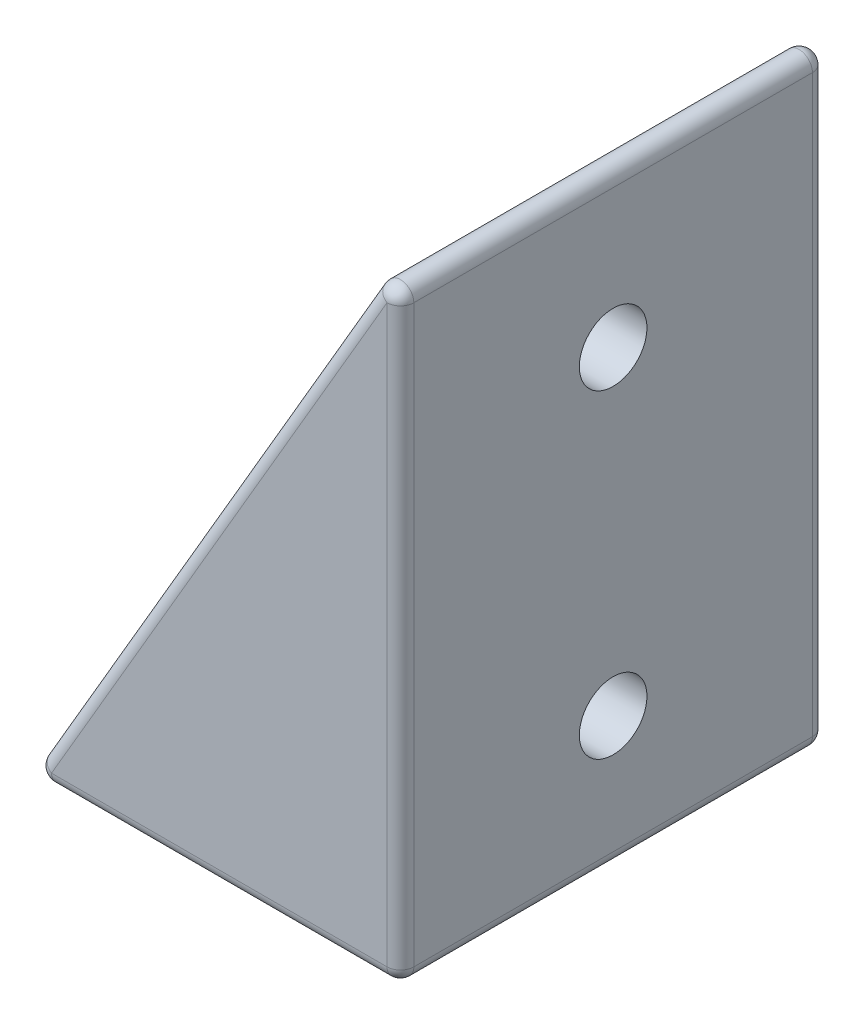
ISO-10303-21;
HEADER;
FILE_DESCRIPTION(('STEP AP214'),'2;1');
FILE_NAME('part.step','',(''),(''),'','','');
FILE_SCHEMA(('AUTOMOTIVE_DESIGN { 1 0 10303 214 1 1 1 1 }'));
ENDSEC;
DATA;
#1=APPLICATION_CONTEXT('core data for automotive mechanical design processes');
#2=APPLICATION_PROTOCOL_DEFINITION('international standard','automotive_design',2000,#1);
#3=PRODUCT_CONTEXT('',#1,'mechanical');
#4=PRODUCT('Part','Part','',(#3));
#5=PRODUCT_RELATED_PRODUCT_CATEGORY('part','',(#4));
#6=PRODUCT_DEFINITION_FORMATION('','',#4);
#7=PRODUCT_DEFINITION_CONTEXT('part definition',#1,'design');
#8=PRODUCT_DEFINITION('design','',#6,#7);
#9=PRODUCT_DEFINITION_SHAPE('','',#8);
#10=(LENGTH_UNIT() NAMED_UNIT(*) SI_UNIT(.MILLI.,.METRE.));
#11=(NAMED_UNIT(*) PLANE_ANGLE_UNIT() SI_UNIT($,.RADIAN.));
#12=(NAMED_UNIT(*) SI_UNIT($,.STERADIAN.) SOLID_ANGLE_UNIT());
#13=UNCERTAINTY_MEASURE_WITH_UNIT(LENGTH_MEASURE(1.E-05),#10,'distance_accuracy_value','');
#14=(GEOMETRIC_REPRESENTATION_CONTEXT(3) GLOBAL_UNCERTAINTY_ASSIGNED_CONTEXT((#13)) GLOBAL_UNIT_ASSIGNED_CONTEXT((#10,
#11,#12)) REPRESENTATION_CONTEXT('',''));
#15=CARTESIAN_POINT('',(0.,0.,0.));
#16=DIRECTION('',(0.,0.,1.));
#17=DIRECTION('',(1.,0.,0.));
#18=AXIS2_PLACEMENT_3D('',#15,#16,#17);
#19=CARTESIAN_POINT('',(-22.225,0.,25.4));
#20=DIRECTION('',(0.,1.,0.));
#21=DIRECTION('',(0.,0.,1.));
#22=AXIS2_PLACEMENT_3D('',#19,#20,#21);
#23=PLANE('',#22);
#24=DIRECTION('',(1.,0.,0.));
#25=VECTOR('',#24,1.);
#26=CARTESIAN_POINT('',(-22.225,0.,24.6));
#27=LINE('',#26,#25);
#28=CARTESIAN_POINT('',(-0.8,0.,24.6));
#29=VERTEX_POINT('',#28);
#30=CARTESIAN_POINT('',(-20.8321704007033,0.,24.6));
#31=VERTEX_POINT('',#30);
#32=EDGE_CURVE('E137',#29,#31,#27,.F.);
#33=ORIENTED_EDGE('',*,*,#32,.T.);
#34=DIRECTION('',(0.,0.,-1.));
#35=VECTOR('',#34,1.);
#36=CARTESIAN_POINT('',(-20.8321704007033,0.,25.4));
#37=LINE('',#36,#35);
#38=CARTESIAN_POINT('',(-20.8321704007033,0.,0.799999999999999));
#39=VERTEX_POINT('',#38);
#40=EDGE_CURVE('E141',#31,#39,#37,.T.);
#41=ORIENTED_EDGE('',*,*,#40,.T.);
#42=DIRECTION('',(1.,0.,0.));
#43=VECTOR('',#42,1.);
#44=CARTESIAN_POINT('',(-22.225,0.,0.799999999999999));
#45=LINE('',#44,#43);
#46=CARTESIAN_POINT('',(-0.8,0.,0.799999999999999));
#47=VERTEX_POINT('',#46);
#48=EDGE_CURVE('E113',#39,#47,#45,.T.);
#49=ORIENTED_EDGE('',*,*,#48,.T.);
#50=DIRECTION('',(0.,0.,-1.));
#51=VECTOR('',#50,1.);
#52=CARTESIAN_POINT('',(-0.799999999999999,0.,25.4));
#53=LINE('',#52,#51);
#54=EDGE_CURVE('E131',#47,#29,#53,.F.);
#55=ORIENTED_EDGE('',*,*,#54,.T.);
#56=EDGE_LOOP('',(#33,#41,#49,#55));
#57=FACE_BOUND('',#56,.T.);
#58=ADVANCED_FACE('F37',(#57),#23,.F.);
#59=CARTESIAN_POINT('',(0.,0.,25.4));
#60=DIRECTION('',(-1.,0.,0.));
#61=DIRECTION('',(0.,0.,1.));
#62=AXIS2_PLACEMENT_3D('',#59,#60,#61);
#63=PLANE('',#62);
#64=CARTESIAN_POINT('',(0.,26.8858635440629,12.7));
#65=DIRECTION('',(1.,0.,0.));
#66=DIRECTION('',(0.,0.,-1.));
#67=AXIS2_PLACEMENT_3D('',#64,#65,#66);
#68=CIRCLE('',#67,2.0193);
#69=CARTESIAN_POINT('',(0.,26.8858635440629,10.6807));
#70=VERTEX_POINT('',#69);
#71=EDGE_CURVE('E209',#70,#70,#68,.T.);
#72=ORIENTED_EDGE('',*,*,#71,.F.);
#73=EDGE_LOOP('',(#72));
#74=FACE_BOUND('',#73,.T.);
#75=CARTESIAN_POINT('',(0.,7.83586354406289,12.7));
#76=DIRECTION('',(1.,0.,0.));
#77=DIRECTION('',(0.,0.,-1.));
#78=AXIS2_PLACEMENT_3D('',#75,#76,#77);
#79=CIRCLE('',#78,2.0193);
#80=CARTESIAN_POINT('',(0.,7.83586354406289,10.6807));
#81=VERTEX_POINT('',#80);
#82=EDGE_CURVE('E214',#81,#81,#79,.T.);
#83=ORIENTED_EDGE('',*,*,#82,.F.);
#84=EDGE_LOOP('',(#83));
#85=FACE_BOUND('',#84,.T.);
#86=DIRECTION('',(0.,0.,-1.));
#87=VECTOR('',#86,1.);
#88=CARTESIAN_POINT('',(0.,0.8,25.4));
#89=LINE('',#88,#87);
#90=CARTESIAN_POINT('',(0.,0.8,24.6));
#91=VERTEX_POINT('',#90);
#92=CARTESIAN_POINT('',(0.,0.8,0.799999999999999));
#93=VERTEX_POINT('',#92);
#94=EDGE_CURVE('E154',#91,#93,#89,.T.);
#95=ORIENTED_EDGE('',*,*,#94,.T.);
#96=DIRECTION('',(0.,1.,0.));
#97=VECTOR('',#96,1.);
#98=CARTESIAN_POINT('',(0.,0.,0.799999999999999));
#99=LINE('',#98,#97);
#100=CARTESIAN_POINT('',(0.,35.1408635440629,0.799999999999999));
#101=VERTEX_POINT('',#100);
#102=EDGE_CURVE('E158',#93,#101,#99,.T.);
#103=ORIENTED_EDGE('',*,*,#102,.T.);
#104=DIRECTION('',(0.,0.,-1.));
#105=VECTOR('',#104,1.);
#106=CARTESIAN_POINT('',(0.,35.1408635440629,25.4));
#107=LINE('',#106,#105);
#108=CARTESIAN_POINT('',(0.,35.1408635440629,24.6));
#109=VERTEX_POINT('',#108);
#110=EDGE_CURVE('E156',#101,#109,#107,.F.);
#111=ORIENTED_EDGE('',*,*,#110,.T.);
#112=DIRECTION('',(0.,1.,0.));
#113=VECTOR('',#112,1.);
#114=CARTESIAN_POINT('',(0.,0.,24.6));
#115=LINE('',#114,#113);
#116=EDGE_CURVE('E152',#109,#91,#115,.F.);
#117=ORIENTED_EDGE('',*,*,#116,.T.);
#118=EDGE_LOOP('',(#95,#103,#111,#117));
#119=FACE_BOUND('',#118,.T.);
#120=ADVANCED_FACE('F225',(#74,#85,#119),#63,.F.);
#121=CARTESIAN_POINT('',(0.,38.1,25.4));
#122=DIRECTION('',(0.863778900898433,-0.503871025524086,0.));
#123=DIRECTION('',(0.503871025524086,0.863778900898434,0.));
#124=AXIS2_PLACEMENT_3D('',#121,#122,#123);
#125=PLANE('',#124);
#126=CARTESIAN_POINT('',(-6.54157959929665,26.8858635440629,12.7));
#127=DIRECTION('',(0.863778900898433,-0.503871025524086,0.));
#128=DIRECTION('',(0.503871025524086,0.863778900898434,0.));
#129=AXIS2_PLACEMENT_3D('',#126,#127,#128);
#130=ELLIPSE('',#129,2.33775101232467,2.0193);
#131=CARTESIAN_POINT('',(-5.36365459929665,28.9051635440629,12.7));
#132=VERTEX_POINT('',#131);
#133=EDGE_CURVE('E41',#132,#132,#130,.T.);
#134=ORIENTED_EDGE('',*,*,#133,.T.);
#135=EDGE_LOOP('',(#134));
#136=FACE_BOUND('',#135,.T.);
#137=CARTESIAN_POINT('',(-17.6540795992967,7.83586354406289,12.7));
#138=DIRECTION('',(0.863778900898433,-0.503871025524086,0.));
#139=DIRECTION('',(0.503871025524086,0.863778900898434,0.));
#140=AXIS2_PLACEMENT_3D('',#137,#138,#139);
#141=ELLIPSE('',#140,2.33775101232467,2.0193);
#142=CARTESIAN_POINT('',(-16.4761545992966,9.85516354406289,12.7));
#143=VERTEX_POINT('',#142);
#144=EDGE_CURVE('E207',#143,#143,#141,.T.);
#145=ORIENTED_EDGE('',*,*,#144,.T.);
#146=EDGE_LOOP('',(#145));
#147=FACE_BOUND('',#146,.T.);
#148=DIRECTION('',(-0.503871025524086,-0.863778900898434,0.));
#149=VECTOR('',#148,1.);
#150=CARTESIAN_POINT('',(0.,38.1,0.799999999999999));
#151=LINE('',#150,#149);
#152=CARTESIAN_POINT('',(-1.49102312071874,35.5439603644822,0.799999999999999));
#153=VERTEX_POINT('',#152);
#154=CARTESIAN_POINT('',(-21.5231935214221,1.20309682041927,0.799999999999999));
#155=VERTEX_POINT('',#154);
#156=EDGE_CURVE('E165',#153,#155,#151,.T.);
#157=ORIENTED_EDGE('',*,*,#156,.T.);
#158=DIRECTION('',(0.,0.,-1.));
#159=VECTOR('',#158,1.);
#160=CARTESIAN_POINT('',(-21.5231935214221,1.20309682041927,25.4));
#161=LINE('',#160,#159);
#162=CARTESIAN_POINT('',(-21.5231935214221,1.20309682041927,24.6));
#163=VERTEX_POINT('',#162);
#164=EDGE_CURVE('E168',#155,#163,#161,.F.);
#165=ORIENTED_EDGE('',*,*,#164,.T.);
#166=DIRECTION('',(-0.503871025524086,-0.863778900898434,0.));
#167=VECTOR('',#166,1.);
#168=CARTESIAN_POINT('',(0.,38.1,24.6));
#169=LINE('',#168,#167);
#170=CARTESIAN_POINT('',(-1.49102312071874,35.5439603644822,24.6));
#171=VERTEX_POINT('',#170);
#172=EDGE_CURVE('E163',#163,#171,#169,.F.);
#173=ORIENTED_EDGE('',*,*,#172,.T.);
#174=DIRECTION('',(0.,0.,-1.));
#175=VECTOR('',#174,1.);
#176=CARTESIAN_POINT('',(-1.49102312071874,35.5439603644822,25.4));
#177=LINE('',#176,#175);
#178=EDGE_CURVE('E161',#171,#153,#177,.T.);
#179=ORIENTED_EDGE('',*,*,#178,.T.);
#180=EDGE_LOOP('',(#157,#165,#173,#179));
#181=FACE_BOUND('',#180,.T.);
#182=ADVANCED_FACE('F228',(#136,#147,#181),#125,.F.);
#183=CARTESIAN_POINT('',(0.,0.,25.4));
#184=DIRECTION('',(0.,0.,1.));
#185=DIRECTION('',(1.,0.,0.));
#186=AXIS2_PLACEMENT_3D('',#183,#184,#185);
#187=PLANE('',#186);
#188=DIRECTION('',(-0.503871025524086,-0.863778900898434,0.));
#189=VECTOR('',#188,1.);
#190=CARTESIAN_POINT('',(-21.5339768792813,-0.403096820419269,25.4));
#191=LINE('',#190,#189);
#192=CARTESIAN_POINT('',(-0.8,35.1408635440629,25.4));
#193=VERTEX_POINT('',#192);
#194=CARTESIAN_POINT('',(-20.8321704007033,0.799999999999999,25.4));
#195=VERTEX_POINT('',#194);
#196=EDGE_CURVE('E46',#193,#195,#191,.T.);
#197=ORIENTED_EDGE('',*,*,#196,.T.);
#198=DIRECTION('',(1.,0.,0.));
#199=VECTOR('',#198,1.);
#200=CARTESIAN_POINT('',(0.,0.8,25.4));
#201=LINE('',#200,#199);
#202=CARTESIAN_POINT('',(-0.8,0.8,25.4));
#203=VERTEX_POINT('',#202);
#204=EDGE_CURVE('E11',#195,#203,#201,.T.);
#205=ORIENTED_EDGE('',*,*,#204,.T.);
#206=DIRECTION('',(0.,1.,0.));
#207=VECTOR('',#206,1.);
#208=CARTESIAN_POINT('',(-0.8,38.1,25.4));
#209=LINE('',#208,#207);
#210=EDGE_CURVE('E56',#203,#193,#209,.T.);
#211=ORIENTED_EDGE('',*,*,#210,.T.);
#212=EDGE_LOOP('',(#197,#205,#211));
#213=FACE_BOUND('',#212,.T.);
#214=ADVANCED_FACE('F276',(#213),#187,.T.);
#215=CARTESIAN_POINT('',(0.,0.,0.));
#216=DIRECTION('',(0.,0.,1.));
#217=DIRECTION('',(1.,0.,0.));
#218=AXIS2_PLACEMENT_3D('',#215,#216,#217);
#219=PLANE('',#218);
#220=DIRECTION('',(0.,1.,0.));
#221=VECTOR('',#220,1.);
#222=CARTESIAN_POINT('',(-0.8,0.,0.));
#223=LINE('',#222,#221);
#224=CARTESIAN_POINT('',(-0.8,35.1408635440629,0.));
#225=VERTEX_POINT('',#224);
#226=CARTESIAN_POINT('',(-0.8,0.8,0.));
#227=VERTEX_POINT('',#226);
#228=EDGE_CURVE('E149',#225,#227,#223,.F.);
#229=ORIENTED_EDGE('',*,*,#228,.T.);
#230=DIRECTION('',(1.,0.,0.));
#231=VECTOR('',#230,1.);
#232=CARTESIAN_POINT('',(0.,0.8,0.));
#233=LINE('',#232,#231);
#234=CARTESIAN_POINT('',(-20.8321704007033,0.8,0.));
#235=VERTEX_POINT('',#234);
#236=EDGE_CURVE('E115',#227,#235,#233,.F.);
#237=ORIENTED_EDGE('',*,*,#236,.T.);
#238=DIRECTION('',(-0.503871025524086,-0.863778900898434,0.));
#239=VECTOR('',#238,1.);
#240=CARTESIAN_POINT('',(-15.8913602989704,9.26996017439938,0.));
#241=LINE('',#240,#239);
#242=EDGE_CURVE('E144',#235,#225,#241,.F.);
#243=ORIENTED_EDGE('',*,*,#242,.T.);
#244=EDGE_LOOP('',(#229,#237,#243));
#245=FACE_BOUND('',#244,.T.);
#246=ADVANCED_FACE('F274',(#245),#219,.F.);
#247=CARTESIAN_POINT('',(-0.799999999999999,35.1408635440629,24.6));
#248=DIRECTION('',(0.,0.,1.));
#249=DIRECTION('',(1.,0.,0.));
#250=AXIS2_PLACEMENT_3D('',#247,#248,#249);
#251=SPHERICAL_SURFACE('',#250,0.8);
#252=CARTESIAN_POINT('',(-0.8,35.1408635440629,24.6));
#253=DIRECTION('',(0.,0.,1.));
#254=DIRECTION('',(1.,0.,0.));
#255=AXIS2_PLACEMENT_3D('',#252,#253,#254);
#256=CIRCLE('',#255,0.8);
#257=EDGE_CURVE('E201',#171,#109,#256,.F.);
#258=ORIENTED_EDGE('',*,*,#257,.F.);
#259=CARTESIAN_POINT('',(-0.799999999999998,35.1408635440629,24.6));
#260=DIRECTION('',(0.503871025524083,0.863778900898435,0.));
#261=DIRECTION('',(-0.863778900898435,0.503871025524083,0.));
#262=AXIS2_PLACEMENT_3D('',#259,#260,#261);
#263=CIRCLE('',#262,0.8);
#264=EDGE_CURVE('E138',#193,#171,#263,.F.);
#265=ORIENTED_EDGE('',*,*,#264,.F.);
#266=CARTESIAN_POINT('',(-0.8,35.1408635440629,24.6));
#267=DIRECTION('',(0.,1.,0.));
#268=DIRECTION('',(0.,0.,1.));
#269=AXIS2_PLACEMENT_3D('',#266,#267,#268);
#270=CIRCLE('',#269,0.8);
#271=EDGE_CURVE('E204',#109,#193,#270,.F.);
#272=ORIENTED_EDGE('',*,*,#271,.F.);
#273=EDGE_LOOP('',(#258,#265,#272));
#274=FACE_BOUND('',#273,.T.);
#275=ADVANCED_FACE('F39',(#274),#251,.T.);
#276=CARTESIAN_POINT('',(-15.8913602989704,9.26996017439938,24.6));
#277=DIRECTION('',(0.503871025524086,0.863778900898434,0.));
#278=DIRECTION('',(-0.863778900898434,0.503871025524086,0.));
#279=AXIS2_PLACEMENT_3D('',#276,#277,#278);
#280=CYLINDRICAL_SURFACE('',#279,0.8);
#281=ORIENTED_EDGE('',*,*,#264,.T.);
#282=ORIENTED_EDGE('',*,*,#172,.F.);
#283=CARTESIAN_POINT('',(-20.8321704007033,0.799999999999999,24.6));
#284=DIRECTION('',(-0.503871025524088,-0.863778900898432,0.));
#285=DIRECTION('',(0.863778900898432,-0.503871025524088,0.));
#286=AXIS2_PLACEMENT_3D('',#283,#284,#285);
#287=CIRCLE('',#286,0.8);
#288=EDGE_CURVE('E198',#195,#163,#287,.T.);
#289=ORIENTED_EDGE('',*,*,#288,.F.);
#290=ORIENTED_EDGE('',*,*,#196,.F.);
#291=EDGE_LOOP('',(#281,#282,#289,#290));
#292=FACE_BOUND('',#291,.T.);
#293=ADVANCED_FACE('F282',(#292),#280,.T.);
#294=CARTESIAN_POINT('',(0.,0.8,24.6));
#295=DIRECTION('',(-1.,0.,0.));
#296=DIRECTION('',(0.,0.,1.));
#297=AXIS2_PLACEMENT_3D('',#294,#295,#296);
#298=CYLINDRICAL_SURFACE('',#297,0.8);
#299=CARTESIAN_POINT('',(-0.8,0.8,24.6));
#300=DIRECTION('',(1.,0.,0.));
#301=DIRECTION('',(0.,0.,-1.));
#302=AXIS2_PLACEMENT_3D('',#299,#300,#301);
#303=CIRCLE('',#302,0.8);
#304=EDGE_CURVE('E192',#203,#29,#303,.T.);
#305=ORIENTED_EDGE('',*,*,#304,.F.);
#306=ORIENTED_EDGE('',*,*,#204,.F.);
#307=CARTESIAN_POINT('',(-20.8321704007033,0.8,24.6));
#308=DIRECTION('',(-1.,0.,0.));
#309=DIRECTION('',(0.,0.,1.));
#310=AXIS2_PLACEMENT_3D('',#307,#308,#309);
#311=CIRCLE('',#310,0.8);
#312=EDGE_CURVE('E195',#31,#195,#311,.T.);
#313=ORIENTED_EDGE('',*,*,#312,.F.);
#314=ORIENTED_EDGE('',*,*,#32,.F.);
#315=EDGE_LOOP('',(#305,#306,#313,#314));
#316=FACE_BOUND('',#315,.T.);
#317=ADVANCED_FACE('F257',(#316),#298,.T.);
#318=CARTESIAN_POINT('',(-0.8,0.,24.6));
#319=DIRECTION('',(0.,-1.,0.));
#320=DIRECTION('',(0.,0.,-1.));
#321=AXIS2_PLACEMENT_3D('',#318,#319,#320);
#322=CYLINDRICAL_SURFACE('',#321,0.8);
#323=ORIENTED_EDGE('',*,*,#271,.T.);
#324=ORIENTED_EDGE('',*,*,#210,.F.);
#325=CARTESIAN_POINT('',(-0.8,0.8,24.6));
#326=DIRECTION('',(0.,-1.,0.));
#327=DIRECTION('',(0.,0.,-1.));
#328=AXIS2_PLACEMENT_3D('',#325,#326,#327);
#329=CIRCLE('',#328,0.8);
#330=EDGE_CURVE('E190',#91,#203,#329,.T.);
#331=ORIENTED_EDGE('',*,*,#330,.F.);
#332=ORIENTED_EDGE('',*,*,#116,.F.);
#333=EDGE_LOOP('',(#323,#324,#331,#332));
#334=FACE_BOUND('',#333,.T.);
#335=ADVANCED_FACE('F252',(#334),#322,.T.);
#336=CARTESIAN_POINT('',(-0.8,35.1408635440629,25.4));
#337=DIRECTION('',(0.,0.,-1.));
#338=DIRECTION('',(-1.,0.,0.));
#339=AXIS2_PLACEMENT_3D('',#336,#337,#338);
#340=CYLINDRICAL_SURFACE('',#339,0.8);
#341=ORIENTED_EDGE('',*,*,#257,.T.);
#342=ORIENTED_EDGE('',*,*,#110,.F.);
#343=CARTESIAN_POINT('',(-0.799999999999998,35.1408635440629,0.799999999999999));
#344=DIRECTION('',(0.,0.,-1.));
#345=DIRECTION('',(-1.,0.,0.));
#346=AXIS2_PLACEMENT_3D('',#343,#344,#345);
#347=CIRCLE('',#346,0.8);
#348=EDGE_CURVE('E187',#153,#101,#347,.T.);
#349=ORIENTED_EDGE('',*,*,#348,.F.);
#350=ORIENTED_EDGE('',*,*,#178,.F.);
#351=EDGE_LOOP('',(#341,#342,#349,#350));
#352=FACE_BOUND('',#351,.T.);
#353=ADVANCED_FACE('F246',(#352),#340,.T.);
#354=CARTESIAN_POINT('',(-20.8321704007033,0.8,24.6));
#355=DIRECTION('',(0.,0.,1.));
#356=DIRECTION('',(1.,0.,0.));
#357=AXIS2_PLACEMENT_3D('',#354,#355,#356);
#358=SPHERICAL_SURFACE('',#357,0.8);
#359=ORIENTED_EDGE('',*,*,#312,.T.);
#360=ORIENTED_EDGE('',*,*,#288,.T.);
#361=CARTESIAN_POINT('',(-20.8321704007033,0.799999999999999,24.6));
#362=DIRECTION('',(0.,0.,1.));
#363=DIRECTION('',(1.,0.,0.));
#364=AXIS2_PLACEMENT_3D('',#361,#362,#363);
#365=CIRCLE('',#364,0.8);
#366=EDGE_CURVE('E181',#31,#163,#365,.F.);
#367=ORIENTED_EDGE('',*,*,#366,.F.);
#368=EDGE_LOOP('',(#359,#360,#367));
#369=FACE_BOUND('',#368,.T.);
#370=ADVANCED_FACE('F262',(#369),#358,.T.);
#371=CARTESIAN_POINT('',(-0.8,0.8,24.6));
#372=DIRECTION('',(0.,0.,1.));
#373=DIRECTION('',(1.,0.,0.));
#374=AXIS2_PLACEMENT_3D('',#371,#372,#373);
#375=SPHERICAL_SURFACE('',#374,0.8);
#376=ORIENTED_EDGE('',*,*,#330,.T.);
#377=ORIENTED_EDGE('',*,*,#304,.T.);
#378=CARTESIAN_POINT('',(-0.8,0.8,24.6));
#379=DIRECTION('',(0.,0.,1.));
#380=DIRECTION('',(1.,0.,0.));
#381=AXIS2_PLACEMENT_3D('',#378,#379,#380);
#382=CIRCLE('',#381,0.8);
#383=EDGE_CURVE('E134',#91,#29,#382,.F.);
#384=ORIENTED_EDGE('',*,*,#383,.F.);
#385=EDGE_LOOP('',(#376,#377,#384));
#386=FACE_BOUND('',#385,.T.);
#387=ADVANCED_FACE('F255',(#386),#375,.T.);
#388=CARTESIAN_POINT('',(-0.799999999999999,35.1408635440629,0.799999999999999));
#389=DIRECTION('',(0.,0.,-1.));
#390=DIRECTION('',(-1.,0.,0.));
#391=AXIS2_PLACEMENT_3D('',#388,#389,#390);
#392=SPHERICAL_SURFACE('',#391,0.8);
#393=CARTESIAN_POINT('',(-0.8,35.1408635440629,0.799999999999999));
#394=DIRECTION('',(0.,1.,0.));
#395=DIRECTION('',(0.,0.,1.));
#396=AXIS2_PLACEMENT_3D('',#393,#394,#395);
#397=CIRCLE('',#396,0.8);
#398=EDGE_CURVE('E178',#225,#101,#397,.F.);
#399=ORIENTED_EDGE('',*,*,#398,.F.);
#400=CARTESIAN_POINT('',(-0.8,35.1408635440629,0.8));
#401=DIRECTION('',(0.503871025524084,0.863778900898435,0.));
#402=DIRECTION('',(-0.863778900898435,0.503871025524084,0.));
#403=AXIS2_PLACEMENT_3D('',#400,#401,#402);
#404=CIRCLE('',#403,0.8);
#405=EDGE_CURVE('E184',#153,#225,#404,.F.);
#406=ORIENTED_EDGE('',*,*,#405,.F.);
#407=ORIENTED_EDGE('',*,*,#348,.T.);
#408=EDGE_LOOP('',(#399,#406,#407));
#409=FACE_BOUND('',#408,.T.);
#410=ADVANCED_FACE('F242',(#409),#392,.T.);
#411=CARTESIAN_POINT('',(0.691023120718747,37.6969031795807,0.799999999999999));
#412=DIRECTION('',(-0.503871025524086,-0.863778900898434,0.));
#413=DIRECTION('',(0.863778900898434,-0.503871025524086,0.));
#414=AXIS2_PLACEMENT_3D('',#411,#412,#413);
#415=CYLINDRICAL_SURFACE('',#414,0.8);
#416=ORIENTED_EDGE('',*,*,#405,.T.);
#417=ORIENTED_EDGE('',*,*,#242,.F.);
#418=CARTESIAN_POINT('',(-20.8321704007033,0.799999999999999,0.799999999999999));
#419=DIRECTION('',(-0.503871025524086,-0.863778900898433,0.));
#420=DIRECTION('',(0.863778900898433,-0.503871025524086,0.));
#421=AXIS2_PLACEMENT_3D('',#418,#419,#420);
#422=CIRCLE('',#421,0.8);
#423=EDGE_CURVE('E175',#155,#235,#422,.T.);
#424=ORIENTED_EDGE('',*,*,#423,.F.);
#425=ORIENTED_EDGE('',*,*,#156,.F.);
#426=EDGE_LOOP('',(#416,#417,#424,#425));
#427=FACE_BOUND('',#426,.T.);
#428=ADVANCED_FACE('F272',(#427),#415,.T.);
#429=CARTESIAN_POINT('',(-20.8321704007033,0.8,25.4));
#430=DIRECTION('',(0.,0.,-1.));
#431=DIRECTION('',(-1.,0.,0.));
#432=AXIS2_PLACEMENT_3D('',#429,#430,#431);
#433=CYLINDRICAL_SURFACE('',#432,0.8);
#434=ORIENTED_EDGE('',*,*,#366,.T.);
#435=ORIENTED_EDGE('',*,*,#164,.F.);
#436=CARTESIAN_POINT('',(-20.8321704007033,0.8,0.799999999999999));
#437=DIRECTION('',(0.,0.,-1.));
#438=DIRECTION('',(-1.,0.,0.));
#439=AXIS2_PLACEMENT_3D('',#436,#437,#438);
#440=CIRCLE('',#439,0.8);
#441=EDGE_CURVE('E128',#39,#155,#440,.T.);
#442=ORIENTED_EDGE('',*,*,#441,.F.);
#443=ORIENTED_EDGE('',*,*,#40,.F.);
#444=EDGE_LOOP('',(#434,#435,#442,#443));
#445=FACE_BOUND('',#444,.T.);
#446=ADVANCED_FACE('F265',(#445),#433,.T.);
#447=CARTESIAN_POINT('',(-0.8,0.8,25.4));
#448=DIRECTION('',(0.,0.,-1.));
#449=DIRECTION('',(-1.,0.,0.));
#450=AXIS2_PLACEMENT_3D('',#447,#448,#449);
#451=CYLINDRICAL_SURFACE('',#450,0.8);
#452=ORIENTED_EDGE('',*,*,#383,.T.);
#453=ORIENTED_EDGE('',*,*,#54,.F.);
#454=CARTESIAN_POINT('',(-0.8,0.8,0.799999999999999));
#455=DIRECTION('',(0.,0.,-1.));
#456=DIRECTION('',(-1.,0.,0.));
#457=AXIS2_PLACEMENT_3D('',#454,#455,#456);
#458=CIRCLE('',#457,0.8);
#459=EDGE_CURVE('E121',#93,#47,#458,.T.);
#460=ORIENTED_EDGE('',*,*,#459,.F.);
#461=ORIENTED_EDGE('',*,*,#94,.F.);
#462=EDGE_LOOP('',(#452,#453,#460,#461));
#463=FACE_BOUND('',#462,.T.);
#464=ADVANCED_FACE('F132',(#463),#451,.T.);
#465=CARTESIAN_POINT('',(-0.8,0.,0.799999999999999));
#466=DIRECTION('',(0.,1.,0.));
#467=DIRECTION('',(0.,0.,1.));
#468=AXIS2_PLACEMENT_3D('',#465,#466,#467);
#469=CYLINDRICAL_SURFACE('',#468,0.8);
#470=ORIENTED_EDGE('',*,*,#398,.T.);
#471=ORIENTED_EDGE('',*,*,#102,.F.);
#472=CARTESIAN_POINT('',(-0.8,0.8,0.8));
#473=DIRECTION('',(0.,-1.,0.));
#474=DIRECTION('',(0.,0.,-1.));
#475=AXIS2_PLACEMENT_3D('',#472,#473,#474);
#476=CIRCLE('',#475,0.8);
#477=EDGE_CURVE('E125',#227,#93,#476,.T.);
#478=ORIENTED_EDGE('',*,*,#477,.F.);
#479=ORIENTED_EDGE('',*,*,#228,.F.);
#480=EDGE_LOOP('',(#470,#471,#478,#479));
#481=FACE_BOUND('',#480,.T.);
#482=ADVANCED_FACE('F235',(#481),#469,.T.);
#483=CARTESIAN_POINT('',(-20.8321704007033,0.8,0.8));
#484=DIRECTION('',(0.,0.,-1.));
#485=DIRECTION('',(-1.,0.,0.));
#486=AXIS2_PLACEMENT_3D('',#483,#484,#485);
#487=SPHERICAL_SURFACE('',#486,0.8);
#488=ORIENTED_EDGE('',*,*,#441,.T.);
#489=ORIENTED_EDGE('',*,*,#423,.T.);
#490=CARTESIAN_POINT('',(-20.8321704007033,0.8,0.8));
#491=DIRECTION('',(-1.,0.,0.));
#492=DIRECTION('',(0.,0.,1.));
#493=AXIS2_PLACEMENT_3D('',#490,#491,#492);
#494=CIRCLE('',#493,0.8);
#495=EDGE_CURVE('E118',#39,#235,#494,.F.);
#496=ORIENTED_EDGE('',*,*,#495,.F.);
#497=EDGE_LOOP('',(#488,#489,#496));
#498=FACE_BOUND('',#497,.T.);
#499=ADVANCED_FACE('F269',(#498),#487,.T.);
#500=CARTESIAN_POINT('',(-0.8,0.8,0.8));
#501=DIRECTION('',(1.,0.,0.));
#502=DIRECTION('',(0.,0.,-1.));
#503=AXIS2_PLACEMENT_3D('',#500,#501,#502);
#504=SPHERICAL_SURFACE('',#503,0.8);
#505=ORIENTED_EDGE('',*,*,#477,.T.);
#506=ORIENTED_EDGE('',*,*,#459,.T.);
#507=CARTESIAN_POINT('',(-0.8,0.8,0.799999999999999));
#508=DIRECTION('',(1.,0.,0.));
#509=DIRECTION('',(0.,0.,-1.));
#510=AXIS2_PLACEMENT_3D('',#507,#508,#509);
#511=CIRCLE('',#510,0.8);
#512=EDGE_CURVE('E109',#227,#47,#511,.F.);
#513=ORIENTED_EDGE('',*,*,#512,.F.);
#514=EDGE_LOOP('',(#505,#506,#513));
#515=FACE_BOUND('',#514,.T.);
#516=ADVANCED_FACE('F123',(#515),#504,.T.);
#517=CARTESIAN_POINT('',(-22.225,0.8,0.799999999999999));
#518=DIRECTION('',(1.,0.,0.));
#519=DIRECTION('',(0.,0.,-1.));
#520=AXIS2_PLACEMENT_3D('',#517,#518,#519);
#521=CYLINDRICAL_SURFACE('',#520,0.8);
#522=ORIENTED_EDGE('',*,*,#495,.T.);
#523=ORIENTED_EDGE('',*,*,#236,.F.);
#524=ORIENTED_EDGE('',*,*,#512,.T.);
#525=ORIENTED_EDGE('',*,*,#48,.F.);
#526=EDGE_LOOP('',(#522,#523,#524,#525));
#527=FACE_BOUND('',#526,.T.);
#528=ADVANCED_FACE('F111',(#527),#521,.T.);
#529=CARTESIAN_POINT('',(-50.8,7.83586354406289,12.7));
#530=DIRECTION('',(1.,0.,0.));
#531=DIRECTION('',(0.,0.,-1.));
#532=AXIS2_PLACEMENT_3D('',#529,#530,#531);
#533=CYLINDRICAL_SURFACE('',#532,2.0193);
#534=ORIENTED_EDGE('',*,*,#82,.T.);
#535=EDGE_LOOP('',(#534));
#536=FACE_BOUND('',#535,.T.);
#537=ORIENTED_EDGE('',*,*,#144,.F.);
#538=EDGE_LOOP('',(#537));
#539=FACE_BOUND('',#538,.T.);
#540=ADVANCED_FACE('F222',(#536,#539),#533,.F.);
#541=CARTESIAN_POINT('',(-50.8,26.8858635440629,12.7));
#542=DIRECTION('',(1.,0.,0.));
#543=DIRECTION('',(0.,0.,-1.));
#544=AXIS2_PLACEMENT_3D('',#541,#542,#543);
#545=CYLINDRICAL_SURFACE('',#544,2.0193);
#546=ORIENTED_EDGE('',*,*,#71,.T.);
#547=EDGE_LOOP('',(#546));
#548=FACE_BOUND('',#547,.T.);
#549=ORIENTED_EDGE('',*,*,#133,.F.);
#550=EDGE_LOOP('',(#549));
#551=FACE_BOUND('',#550,.T.);
#552=ADVANCED_FACE('F327',(#548,#551),#545,.F.);
#553=CLOSED_SHELL('',(#58,#120,#182,#214,#246,#275,#293,#317,#335,#353,#370,#387,#410,#428,#446,
#464,#482,#499,#516,#528,#540,#552));
#554=MANIFOLD_SOLID_BREP('B2',#553);
#555=ADVANCED_BREP_SHAPE_REPRESENTATION('',(#18,#554),#14);
#556=SHAPE_DEFINITION_REPRESENTATION(#9,#555);
ENDSEC;
END-ISO-10303-21;
